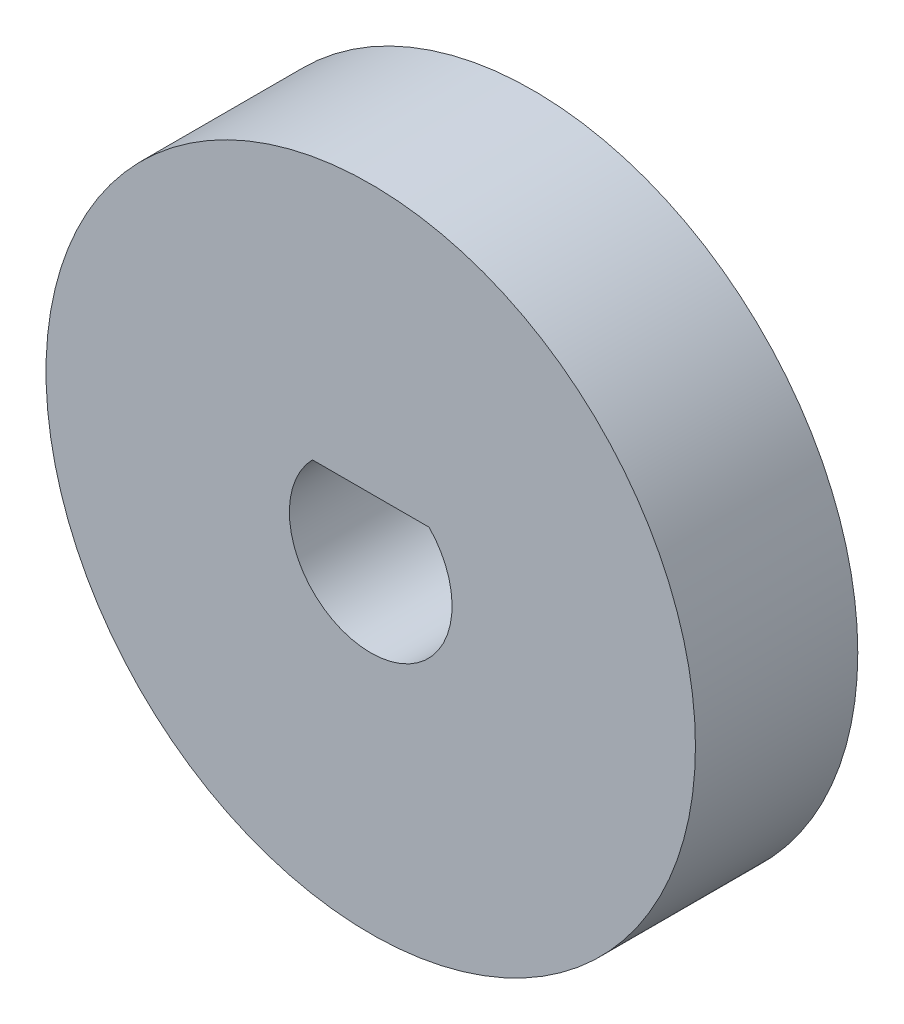
ISO-10303-21;
HEADER;
FILE_DESCRIPTION(('STEP AP214'),'2;1');
FILE_NAME('part.step','',(''),(''),'','','');
FILE_SCHEMA(('AUTOMOTIVE_DESIGN { 1 0 10303 214 1 1 1 1 }'));
ENDSEC;
DATA;
#1=APPLICATION_CONTEXT('core data for automotive mechanical design processes');
#2=APPLICATION_PROTOCOL_DEFINITION('international standard','automotive_design',2000,#1);
#3=PRODUCT_CONTEXT('',#1,'mechanical');
#4=PRODUCT('Part','Part','',(#3));
#5=PRODUCT_RELATED_PRODUCT_CATEGORY('part','',(#4));
#6=PRODUCT_DEFINITION_FORMATION('','',#4);
#7=PRODUCT_DEFINITION_CONTEXT('part definition',#1,'design');
#8=PRODUCT_DEFINITION('design','',#6,#7);
#9=PRODUCT_DEFINITION_SHAPE('','',#8);
#10=(LENGTH_UNIT() NAMED_UNIT(*) SI_UNIT(.MILLI.,.METRE.));
#11=(NAMED_UNIT(*) PLANE_ANGLE_UNIT() SI_UNIT($,.RADIAN.));
#12=(NAMED_UNIT(*) SI_UNIT($,.STERADIAN.) SOLID_ANGLE_UNIT());
#13=UNCERTAINTY_MEASURE_WITH_UNIT(LENGTH_MEASURE(1.E-05),#10,'distance_accuracy_value','');
#14=(GEOMETRIC_REPRESENTATION_CONTEXT(3) GLOBAL_UNCERTAINTY_ASSIGNED_CONTEXT((#13)) GLOBAL_UNIT_ASSIGNED_CONTEXT((#10,
#11,#12)) REPRESENTATION_CONTEXT('',''));
#15=CARTESIAN_POINT('',(0.,0.,0.));
#16=DIRECTION('',(0.,0.,1.));
#17=DIRECTION('',(1.,0.,0.));
#18=AXIS2_PLACEMENT_3D('',#15,#16,#17);
#19=CARTESIAN_POINT('',(0.,0.,6.35));
#20=DIRECTION('',(0.,0.,1.));
#21=DIRECTION('',(1.,0.,0.));
#22=AXIS2_PLACEMENT_3D('',#19,#20,#21);
#23=PLANE('',#22);
#24=CARTESIAN_POINT('',(0.,0.,6.35));
#25=DIRECTION('',(0.,0.,1.));
#26=DIRECTION('',(1.,0.,0.));
#27=AXIS2_PLACEMENT_3D('',#24,#25,#26);
#28=CIRCLE('',#27,12.7);
#29=CARTESIAN_POINT('',(12.7,0.,6.35));
#30=VERTEX_POINT('',#29);
#31=EDGE_CURVE('E11',#30,#30,#28,.T.);
#32=ORIENTED_EDGE('',*,*,#31,.T.);
#33=EDGE_LOOP('',(#32));
#34=FACE_BOUND('',#33,.T.);
#35=DIRECTION('',(-1.,0.,0.));
#36=VECTOR('',#35,1.);
#37=CARTESIAN_POINT('',(-2.28246949596265,2.21615,6.35));
#38=LINE('',#37,#36);
#39=CARTESIAN_POINT('',(2.28246949596265,2.21615,6.35));
#40=VERTEX_POINT('',#39);
#41=CARTESIAN_POINT('',(-2.28246949596265,2.21615,6.35));
#42=VERTEX_POINT('',#41);
#43=EDGE_CURVE('E84',#40,#42,#38,.T.);
#44=ORIENTED_EDGE('',*,*,#43,.F.);
#45=CARTESIAN_POINT('',(0.,0.,6.35));
#46=DIRECTION('',(0.,0.,1.));
#47=DIRECTION('',(1.,0.,0.));
#48=AXIS2_PLACEMENT_3D('',#45,#46,#47);
#49=CIRCLE('',#48,3.18135);
#50=EDGE_CURVE('E73',#42,#40,#49,.T.);
#51=ORIENTED_EDGE('',*,*,#50,.F.);
#52=EDGE_LOOP('',(#44,#51));
#53=FACE_BOUND('',#52,.T.);
#54=ADVANCED_FACE('F39',(#34,#53),#23,.T.);
#55=CARTESIAN_POINT('',(0.,0.,0.));
#56=DIRECTION('',(0.,0.,1.));
#57=DIRECTION('',(1.,0.,0.));
#58=AXIS2_PLACEMENT_3D('',#55,#56,#57);
#59=PLANE('',#58);
#60=CARTESIAN_POINT('',(0.,0.,0.));
#61=DIRECTION('',(0.,0.,1.));
#62=DIRECTION('',(1.,0.,0.));
#63=AXIS2_PLACEMENT_3D('',#60,#61,#62);
#64=CIRCLE('',#63,12.7);
#65=CARTESIAN_POINT('',(12.7,0.,0.));
#66=VERTEX_POINT('',#65);
#67=EDGE_CURVE('E43',#66,#66,#64,.T.);
#68=ORIENTED_EDGE('',*,*,#67,.F.);
#69=EDGE_LOOP('',(#68));
#70=FACE_BOUND('',#69,.T.);
#71=CARTESIAN_POINT('',(0.,0.,0.));
#72=DIRECTION('',(0.,0.,1.));
#73=DIRECTION('',(1.,0.,0.));
#74=AXIS2_PLACEMENT_3D('',#71,#72,#73);
#75=CIRCLE('',#74,3.18135);
#76=CARTESIAN_POINT('',(-2.28246949596265,2.21615,0.));
#77=VERTEX_POINT('',#76);
#78=CARTESIAN_POINT('',(2.28246949596265,2.21615,0.));
#79=VERTEX_POINT('',#78);
#80=EDGE_CURVE('E62',#77,#79,#75,.T.);
#81=ORIENTED_EDGE('',*,*,#80,.T.);
#82=DIRECTION('',(-1.,0.,0.));
#83=VECTOR('',#82,1.);
#84=CARTESIAN_POINT('',(-2.28246949596265,2.21615,0.));
#85=LINE('',#84,#83);
#86=EDGE_CURVE('E68',#79,#77,#85,.T.);
#87=ORIENTED_EDGE('',*,*,#86,.T.);
#88=EDGE_LOOP('',(#81,#87));
#89=FACE_BOUND('',#88,.T.);
#90=ADVANCED_FACE('F80',(#70,#89),#59,.F.);
#91=CARTESIAN_POINT('',(0.,0.,6.35));
#92=DIRECTION('',(0.,0.,-1.));
#93=DIRECTION('',(-1.,0.,0.));
#94=AXIS2_PLACEMENT_3D('',#91,#92,#93);
#95=CYLINDRICAL_SURFACE('',#94,12.7);
#96=ORIENTED_EDGE('',*,*,#31,.F.);
#97=EDGE_LOOP('',(#96));
#98=FACE_BOUND('',#97,.T.);
#99=ORIENTED_EDGE('',*,*,#67,.T.);
#100=EDGE_LOOP('',(#99));
#101=FACE_BOUND('',#100,.T.);
#102=ADVANCED_FACE('F41',(#98,#101),#95,.T.);
#103=CARTESIAN_POINT('',(0.,0.,6.35));
#104=DIRECTION('',(0.,0.,-1.));
#105=DIRECTION('',(-1.,0.,0.));
#106=AXIS2_PLACEMENT_3D('',#103,#104,#105);
#107=CYLINDRICAL_SURFACE('',#106,3.18135);
#108=ORIENTED_EDGE('',*,*,#80,.F.);
#109=DIRECTION('',(0.,0.,-1.));
#110=VECTOR('',#109,1.);
#111=CARTESIAN_POINT('',(-2.28246949596265,2.21615,6.35));
#112=LINE('',#111,#110);
#113=EDGE_CURVE('E70',#42,#77,#112,.T.);
#114=ORIENTED_EDGE('',*,*,#113,.F.);
#115=ORIENTED_EDGE('',*,*,#50,.T.);
#116=DIRECTION('',(0.,0.,-1.));
#117=VECTOR('',#116,1.);
#118=CARTESIAN_POINT('',(2.28246949596265,2.21615,6.35));
#119=LINE('',#118,#117);
#120=EDGE_CURVE('E55',#40,#79,#119,.T.);
#121=ORIENTED_EDGE('',*,*,#120,.T.);
#122=EDGE_LOOP('',(#108,#114,#115,#121));
#123=FACE_BOUND('',#122,.T.);
#124=ADVANCED_FACE('F75',(#123),#107,.F.);
#125=CARTESIAN_POINT('',(-2.28246949596265,2.21615,6.35));
#126=DIRECTION('',(0.,-1.,0.));
#127=DIRECTION('',(0.,0.,-1.));
#128=AXIS2_PLACEMENT_3D('',#125,#126,#127);
#129=PLANE('',#128);
#130=ORIENTED_EDGE('',*,*,#86,.F.);
#131=ORIENTED_EDGE('',*,*,#120,.F.);
#132=ORIENTED_EDGE('',*,*,#43,.T.);
#133=ORIENTED_EDGE('',*,*,#113,.T.);
#134=EDGE_LOOP('',(#130,#131,#132,#133));
#135=FACE_BOUND('',#134,.T.);
#136=ADVANCED_FACE('F69',(#135),#129,.T.);
#137=CLOSED_SHELL('',(#54,#90,#102,#124,#136));
#138=MANIFOLD_SOLID_BREP('B2',#137);
#139=ADVANCED_BREP_SHAPE_REPRESENTATION('',(#18,#138),#14);
#140=SHAPE_DEFINITION_REPRESENTATION(#9,#139);
ENDSEC;
END-ISO-10303-21;
